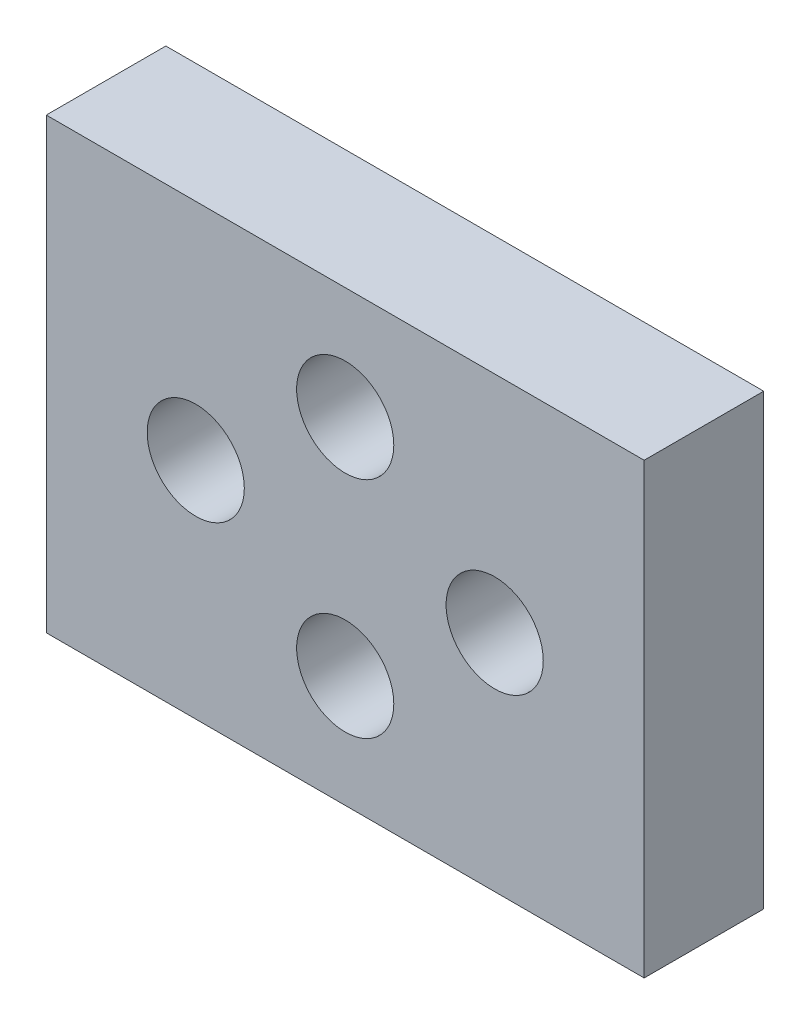
ISO-10303-21;
HEADER;
FILE_DESCRIPTION(('STEP AP214'),'2;1');
FILE_NAME('part.step','',(''),(''),'','','');
FILE_SCHEMA(('AUTOMOTIVE_DESIGN { 1 0 10303 214 1 1 1 1 }'));
ENDSEC;
DATA;
#1=APPLICATION_CONTEXT('core data for automotive mechanical design processes');
#2=APPLICATION_PROTOCOL_DEFINITION('international standard','automotive_design',2000,#1);
#3=PRODUCT_CONTEXT('',#1,'mechanical');
#4=PRODUCT('Part','Part','',(#3));
#5=PRODUCT_RELATED_PRODUCT_CATEGORY('part','',(#4));
#6=PRODUCT_DEFINITION_FORMATION('','',#4);
#7=PRODUCT_DEFINITION_CONTEXT('part definition',#1,'design');
#8=PRODUCT_DEFINITION('design','',#6,#7);
#9=PRODUCT_DEFINITION_SHAPE('','',#8);
#10=(LENGTH_UNIT() NAMED_UNIT(*) SI_UNIT(.MILLI.,.METRE.));
#11=(NAMED_UNIT(*) PLANE_ANGLE_UNIT() SI_UNIT($,.RADIAN.));
#12=(NAMED_UNIT(*) SI_UNIT($,.STERADIAN.) SOLID_ANGLE_UNIT());
#13=UNCERTAINTY_MEASURE_WITH_UNIT(LENGTH_MEASURE(1.E-05),#10,'distance_accuracy_value','');
#14=(GEOMETRIC_REPRESENTATION_CONTEXT(3) GLOBAL_UNCERTAINTY_ASSIGNED_CONTEXT((#13)) GLOBAL_UNIT_ASSIGNED_CONTEXT((#10,
#11,#12)) REPRESENTATION_CONTEXT('',''));
#15=CARTESIAN_POINT('',(0.,0.,0.));
#16=DIRECTION('',(0.,0.,1.));
#17=DIRECTION('',(1.,0.,0.));
#18=AXIS2_PLACEMENT_3D('',#15,#16,#17);
#19=CARTESIAN_POINT('',(-20.,-15.,8.));
#20=DIRECTION('',(1.,0.,0.));
#21=DIRECTION('',(0.,0.,-1.));
#22=AXIS2_PLACEMENT_3D('',#19,#20,#21);
#23=PLANE('',#22);
#24=DIRECTION('',(0.,-1.,0.));
#25=VECTOR('',#24,1.);
#26=CARTESIAN_POINT('',(-20.,-15.,0.));
#27=LINE('',#26,#25);
#28=CARTESIAN_POINT('',(-20.,15.,0.));
#29=VERTEX_POINT('',#28);
#30=CARTESIAN_POINT('',(-20.,-15.,0.));
#31=VERTEX_POINT('',#30);
#32=EDGE_CURVE('E111',#29,#31,#27,.T.);
#33=ORIENTED_EDGE('',*,*,#32,.T.);
#34=DIRECTION('',(0.,0.,-1.));
#35=VECTOR('',#34,1.);
#36=CARTESIAN_POINT('',(-20.,-15.,8.));
#37=LINE('',#36,#35);
#38=CARTESIAN_POINT('',(-20.,-15.,8.));
#39=VERTEX_POINT('',#38);
#40=EDGE_CURVE('E11',#39,#31,#37,.T.);
#41=ORIENTED_EDGE('',*,*,#40,.F.);
#42=DIRECTION('',(0.,-1.,0.));
#43=VECTOR('',#42,1.);
#44=CARTESIAN_POINT('',(-20.,-15.,8.));
#45=LINE('',#44,#43);
#46=CARTESIAN_POINT('',(-20.,15.,8.));
#47=VERTEX_POINT('',#46);
#48=EDGE_CURVE('E100',#47,#39,#45,.T.);
#49=ORIENTED_EDGE('',*,*,#48,.F.);
#50=DIRECTION('',(0.,0.,-1.));
#51=VECTOR('',#50,1.);
#52=CARTESIAN_POINT('',(-20.,15.,8.));
#53=LINE('',#52,#51);
#54=EDGE_CURVE('E109',#47,#29,#53,.T.);
#55=ORIENTED_EDGE('',*,*,#54,.T.);
#56=EDGE_LOOP('',(#33,#41,#49,#55));
#57=FACE_BOUND('',#56,.T.);
#58=ADVANCED_FACE('F44',(#57),#23,.F.);
#59=CARTESIAN_POINT('',(20.,-15.,8.));
#60=DIRECTION('',(0.,1.,0.));
#61=DIRECTION('',(-1.,0.,0.));
#62=AXIS2_PLACEMENT_3D('',#59,#60,#61);
#63=PLANE('',#62);
#64=DIRECTION('',(1.,0.,0.));
#65=VECTOR('',#64,1.);
#66=CARTESIAN_POINT('',(20.,-15.,0.));
#67=LINE('',#66,#65);
#68=CARTESIAN_POINT('',(20.,-15.,0.));
#69=VERTEX_POINT('',#68);
#70=EDGE_CURVE('E105',#31,#69,#67,.T.);
#71=ORIENTED_EDGE('',*,*,#70,.T.);
#72=DIRECTION('',(0.,0.,-1.));
#73=VECTOR('',#72,1.);
#74=CARTESIAN_POINT('',(20.,-15.,8.));
#75=LINE('',#74,#73);
#76=CARTESIAN_POINT('',(20.,-15.,8.));
#77=VERTEX_POINT('',#76);
#78=EDGE_CURVE('E53',#77,#69,#75,.T.);
#79=ORIENTED_EDGE('',*,*,#78,.F.);
#80=DIRECTION('',(1.,0.,0.));
#81=VECTOR('',#80,1.);
#82=CARTESIAN_POINT('',(20.,-15.,8.));
#83=LINE('',#82,#81);
#84=EDGE_CURVE('E95',#39,#77,#83,.T.);
#85=ORIENTED_EDGE('',*,*,#84,.F.);
#86=ORIENTED_EDGE('',*,*,#40,.T.);
#87=EDGE_LOOP('',(#71,#79,#85,#86));
#88=FACE_BOUND('',#87,.T.);
#89=ADVANCED_FACE('F102',(#88),#63,.F.);
#90=CARTESIAN_POINT('',(20.,-15.,8.));
#91=DIRECTION('',(-1.,0.,0.));
#92=DIRECTION('',(0.,0.,1.));
#93=AXIS2_PLACEMENT_3D('',#90,#91,#92);
#94=PLANE('',#93);
#95=DIRECTION('',(0.,1.,0.));
#96=VECTOR('',#95,1.);
#97=CARTESIAN_POINT('',(20.,-15.,0.));
#98=LINE('',#97,#96);
#99=CARTESIAN_POINT('',(20.,15.,0.));
#100=VERTEX_POINT('',#99);
#101=EDGE_CURVE('E80',#69,#100,#98,.T.);
#102=ORIENTED_EDGE('',*,*,#101,.T.);
#103=DIRECTION('',(0.,0.,-1.));
#104=VECTOR('',#103,1.);
#105=CARTESIAN_POINT('',(20.,15.,8.));
#106=LINE('',#105,#104);
#107=CARTESIAN_POINT('',(20.,15.,8.));
#108=VERTEX_POINT('',#107);
#109=EDGE_CURVE('E101',#108,#100,#106,.T.);
#110=ORIENTED_EDGE('',*,*,#109,.F.);
#111=DIRECTION('',(0.,1.,0.));
#112=VECTOR('',#111,1.);
#113=CARTESIAN_POINT('',(20.,-15.,8.));
#114=LINE('',#113,#112);
#115=EDGE_CURVE('E94',#77,#108,#114,.T.);
#116=ORIENTED_EDGE('',*,*,#115,.F.);
#117=ORIENTED_EDGE('',*,*,#78,.T.);
#118=EDGE_LOOP('',(#102,#110,#116,#117));
#119=FACE_BOUND('',#118,.T.);
#120=ADVANCED_FACE('F103',(#119),#94,.F.);
#121=CARTESIAN_POINT('',(20.,15.,8.));
#122=DIRECTION('',(0.,-1.,0.));
#123=DIRECTION('',(1.,0.,0.));
#124=AXIS2_PLACEMENT_3D('',#121,#122,#123);
#125=PLANE('',#124);
#126=DIRECTION('',(-1.,0.,0.));
#127=VECTOR('',#126,1.);
#128=CARTESIAN_POINT('',(20.,15.,0.));
#129=LINE('',#128,#127);
#130=EDGE_CURVE('E82',#100,#29,#129,.T.);
#131=ORIENTED_EDGE('',*,*,#130,.T.);
#132=ORIENTED_EDGE('',*,*,#54,.F.);
#133=DIRECTION('',(-1.,0.,0.));
#134=VECTOR('',#133,1.);
#135=CARTESIAN_POINT('',(20.,15.,8.));
#136=LINE('',#135,#134);
#137=EDGE_CURVE('E65',#108,#47,#136,.T.);
#138=ORIENTED_EDGE('',*,*,#137,.F.);
#139=ORIENTED_EDGE('',*,*,#109,.T.);
#140=EDGE_LOOP('',(#131,#132,#138,#139));
#141=FACE_BOUND('',#140,.T.);
#142=ADVANCED_FACE('F130',(#141),#125,.F.);
#143=CARTESIAN_POINT('',(0.,0.,8.));
#144=DIRECTION('',(0.,0.,1.));
#145=DIRECTION('',(1.,0.,0.));
#146=AXIS2_PLACEMENT_3D('',#143,#144,#145);
#147=PLANE('',#146);
#148=CARTESIAN_POINT('',(-10.,0.,8.));
#149=DIRECTION('',(0.,0.,1.));
#150=DIRECTION('',(1.,0.,0.));
#151=AXIS2_PLACEMENT_3D('',#148,#149,#150);
#152=CIRCLE('',#151,3.25);
#153=CARTESIAN_POINT('',(-6.75,0.,8.));
#154=VERTEX_POINT('',#153);
#155=EDGE_CURVE('E156',#154,#154,#152,.T.);
#156=ORIENTED_EDGE('',*,*,#155,.F.);
#157=EDGE_LOOP('',(#156));
#158=FACE_BOUND('',#157,.T.);
#159=CARTESIAN_POINT('',(10.,0.,8.));
#160=DIRECTION('',(0.,0.,1.));
#161=DIRECTION('',(1.,0.,0.));
#162=AXIS2_PLACEMENT_3D('',#159,#160,#161);
#163=CIRCLE('',#162,3.25);
#164=CARTESIAN_POINT('',(13.25,0.,8.));
#165=VERTEX_POINT('',#164);
#166=EDGE_CURVE('E154',#165,#165,#163,.T.);
#167=ORIENTED_EDGE('',*,*,#166,.F.);
#168=EDGE_LOOP('',(#167));
#169=FACE_BOUND('',#168,.T.);
#170=CARTESIAN_POINT('',(0.,7.5,8.));
#171=DIRECTION('',(0.,0.,1.));
#172=DIRECTION('',(1.,0.,0.));
#173=AXIS2_PLACEMENT_3D('',#170,#171,#172);
#174=CIRCLE('',#173,3.25);
#175=CARTESIAN_POINT('',(3.25,7.5,8.));
#176=VERTEX_POINT('',#175);
#177=EDGE_CURVE('E147',#176,#176,#174,.T.);
#178=ORIENTED_EDGE('',*,*,#177,.F.);
#179=EDGE_LOOP('',(#178));
#180=FACE_BOUND('',#179,.T.);
#181=CARTESIAN_POINT('',(0.,-7.5,8.));
#182=DIRECTION('',(0.,0.,1.));
#183=DIRECTION('',(1.,0.,0.));
#184=AXIS2_PLACEMENT_3D('',#181,#182,#183);
#185=CIRCLE('',#184,3.25);
#186=CARTESIAN_POINT('',(3.25,-7.5,8.));
#187=VERTEX_POINT('',#186);
#188=EDGE_CURVE('E138',#187,#187,#185,.T.);
#189=ORIENTED_EDGE('',*,*,#188,.F.);
#190=EDGE_LOOP('',(#189));
#191=FACE_BOUND('',#190,.T.);
#192=ORIENTED_EDGE('',*,*,#48,.T.);
#193=ORIENTED_EDGE('',*,*,#84,.T.);
#194=ORIENTED_EDGE('',*,*,#115,.T.);
#195=ORIENTED_EDGE('',*,*,#137,.T.);
#196=EDGE_LOOP('',(#192,#193,#194,#195));
#197=FACE_BOUND('',#196,.T.);
#198=ADVANCED_FACE('F93',(#158,#169,#180,#191,#197),#147,.T.);
#199=CARTESIAN_POINT('',(0.,0.,0.));
#200=DIRECTION('',(0.,0.,1.));
#201=DIRECTION('',(1.,0.,0.));
#202=AXIS2_PLACEMENT_3D('',#199,#200,#201);
#203=PLANE('',#202);
#204=CARTESIAN_POINT('',(-10.,0.,0.));
#205=DIRECTION('',(0.,0.,1.));
#206=DIRECTION('',(1.,0.,0.));
#207=AXIS2_PLACEMENT_3D('',#204,#205,#206);
#208=CIRCLE('',#207,3.25);
#209=CARTESIAN_POINT('',(-6.75,0.,0.));
#210=VERTEX_POINT('',#209);
#211=EDGE_CURVE('E120',#210,#210,#208,.T.);
#212=ORIENTED_EDGE('',*,*,#211,.T.);
#213=EDGE_LOOP('',(#212));
#214=FACE_BOUND('',#213,.T.);
#215=CARTESIAN_POINT('',(10.,0.,0.));
#216=DIRECTION('',(0.,0.,1.));
#217=DIRECTION('',(1.,0.,0.));
#218=AXIS2_PLACEMENT_3D('',#215,#216,#217);
#219=CIRCLE('',#218,3.25);
#220=CARTESIAN_POINT('',(13.25,0.,0.));
#221=VERTEX_POINT('',#220);
#222=EDGE_CURVE('E148',#221,#221,#219,.T.);
#223=ORIENTED_EDGE('',*,*,#222,.T.);
#224=EDGE_LOOP('',(#223));
#225=FACE_BOUND('',#224,.T.);
#226=CARTESIAN_POINT('',(0.,7.5,0.));
#227=DIRECTION('',(0.,0.,1.));
#228=DIRECTION('',(1.,0.,0.));
#229=AXIS2_PLACEMENT_3D('',#226,#227,#228);
#230=CIRCLE('',#229,3.25);
#231=CARTESIAN_POINT('',(3.25,7.5,0.));
#232=VERTEX_POINT('',#231);
#233=EDGE_CURVE('E145',#232,#232,#230,.T.);
#234=ORIENTED_EDGE('',*,*,#233,.T.);
#235=EDGE_LOOP('',(#234));
#236=FACE_BOUND('',#235,.T.);
#237=CARTESIAN_POINT('',(0.,-7.5,0.));
#238=DIRECTION('',(0.,0.,1.));
#239=DIRECTION('',(1.,0.,0.));
#240=AXIS2_PLACEMENT_3D('',#237,#238,#239);
#241=CIRCLE('',#240,3.25);
#242=CARTESIAN_POINT('',(3.25,-7.5,0.));
#243=VERTEX_POINT('',#242);
#244=EDGE_CURVE('E132',#243,#243,#241,.T.);
#245=ORIENTED_EDGE('',*,*,#244,.T.);
#246=EDGE_LOOP('',(#245));
#247=FACE_BOUND('',#246,.T.);
#248=ORIENTED_EDGE('',*,*,#32,.F.);
#249=ORIENTED_EDGE('',*,*,#130,.F.);
#250=ORIENTED_EDGE('',*,*,#101,.F.);
#251=ORIENTED_EDGE('',*,*,#70,.F.);
#252=EDGE_LOOP('',(#248,#249,#250,#251));
#253=FACE_BOUND('',#252,.T.);
#254=ADVANCED_FACE('F127',(#214,#225,#236,#247,#253),#203,.F.);
#255=CARTESIAN_POINT('',(0.,-7.5,0.));
#256=DIRECTION('',(0.,0.,1.));
#257=DIRECTION('',(1.,0.,0.));
#258=AXIS2_PLACEMENT_3D('',#255,#256,#257);
#259=CYLINDRICAL_SURFACE('',#258,3.25);
#260=ORIENTED_EDGE('',*,*,#244,.F.);
#261=EDGE_LOOP('',(#260));
#262=FACE_BOUND('',#261,.T.);
#263=ORIENTED_EDGE('',*,*,#188,.T.);
#264=EDGE_LOOP('',(#263));
#265=FACE_BOUND('',#264,.T.);
#266=ADVANCED_FACE('F182',(#262,#265),#259,.F.);
#267=CARTESIAN_POINT('',(0.,7.5,0.));
#268=DIRECTION('',(0.,0.,1.));
#269=DIRECTION('',(1.,0.,0.));
#270=AXIS2_PLACEMENT_3D('',#267,#268,#269);
#271=CYLINDRICAL_SURFACE('',#270,3.25);
#272=ORIENTED_EDGE('',*,*,#233,.F.);
#273=EDGE_LOOP('',(#272));
#274=FACE_BOUND('',#273,.T.);
#275=ORIENTED_EDGE('',*,*,#177,.T.);
#276=EDGE_LOOP('',(#275));
#277=FACE_BOUND('',#276,.T.);
#278=ADVANCED_FACE('F186',(#274,#277),#271,.F.);
#279=CARTESIAN_POINT('',(10.,0.,0.));
#280=DIRECTION('',(0.,0.,1.));
#281=DIRECTION('',(1.,0.,0.));
#282=AXIS2_PLACEMENT_3D('',#279,#280,#281);
#283=CYLINDRICAL_SURFACE('',#282,3.25);
#284=ORIENTED_EDGE('',*,*,#222,.F.);
#285=EDGE_LOOP('',(#284));
#286=FACE_BOUND('',#285,.T.);
#287=ORIENTED_EDGE('',*,*,#166,.T.);
#288=EDGE_LOOP('',(#287));
#289=FACE_BOUND('',#288,.T.);
#290=ADVANCED_FACE('F173',(#286,#289),#283,.F.);
#291=CARTESIAN_POINT('',(-10.,0.,0.));
#292=DIRECTION('',(0.,0.,1.));
#293=DIRECTION('',(1.,0.,0.));
#294=AXIS2_PLACEMENT_3D('',#291,#292,#293);
#295=CYLINDRICAL_SURFACE('',#294,3.25);
#296=ORIENTED_EDGE('',*,*,#211,.F.);
#297=EDGE_LOOP('',(#296));
#298=FACE_BOUND('',#297,.T.);
#299=ORIENTED_EDGE('',*,*,#155,.T.);
#300=EDGE_LOOP('',(#299));
#301=FACE_BOUND('',#300,.T.);
#302=ADVANCED_FACE('F166',(#298,#301),#295,.F.);
#303=CLOSED_SHELL('',(#58,#89,#120,#142,#198,#254,#266,#278,#290,#302));
#304=MANIFOLD_SOLID_BREP('B2',#303);
#305=ADVANCED_BREP_SHAPE_REPRESENTATION('',(#18,#304),#14);
#306=SHAPE_DEFINITION_REPRESENTATION(#9,#305);
ENDSEC;
END-ISO-10303-21;
